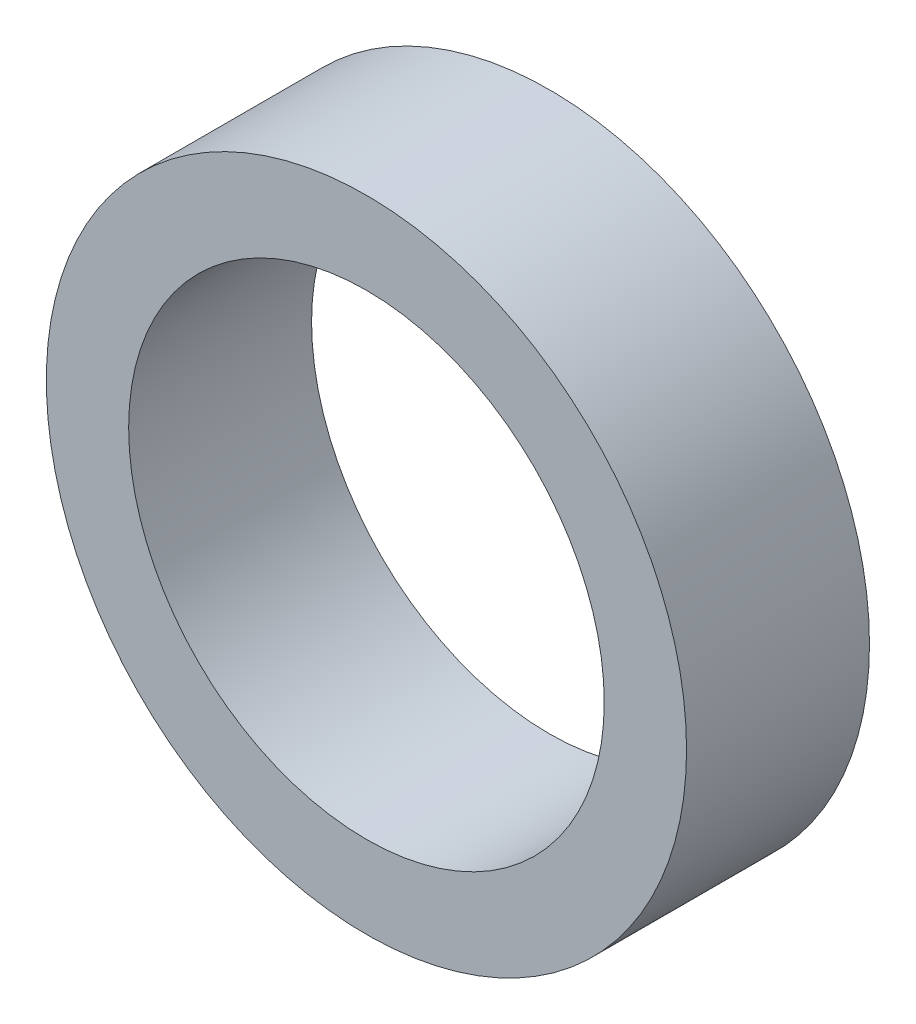
ISO-10303-21;
HEADER;
FILE_DESCRIPTION(('STEP AP214'),'2;1');
FILE_NAME('part.step','',(''),(''),'','','');
FILE_SCHEMA(('AUTOMOTIVE_DESIGN { 1 0 10303 214 1 1 1 1 }'));
ENDSEC;
DATA;
#1=APPLICATION_CONTEXT('core data for automotive mechanical design processes');
#2=APPLICATION_PROTOCOL_DEFINITION('international standard','automotive_design',2000,#1);
#3=PRODUCT_CONTEXT('',#1,'mechanical');
#4=PRODUCT('Part','Part','',(#3));
#5=PRODUCT_RELATED_PRODUCT_CATEGORY('part','',(#4));
#6=PRODUCT_DEFINITION_FORMATION('','',#4);
#7=PRODUCT_DEFINITION_CONTEXT('part definition',#1,'design');
#8=PRODUCT_DEFINITION('design','',#6,#7);
#9=PRODUCT_DEFINITION_SHAPE('','',#8);
#10=(LENGTH_UNIT() NAMED_UNIT(*) SI_UNIT(.MILLI.,.METRE.));
#11=(NAMED_UNIT(*) PLANE_ANGLE_UNIT() SI_UNIT($,.RADIAN.));
#12=(NAMED_UNIT(*) SI_UNIT($,.STERADIAN.) SOLID_ANGLE_UNIT());
#13=UNCERTAINTY_MEASURE_WITH_UNIT(LENGTH_MEASURE(1.E-05),#10,'distance_accuracy_value','');
#14=(GEOMETRIC_REPRESENTATION_CONTEXT(3) GLOBAL_UNCERTAINTY_ASSIGNED_CONTEXT((#13)) GLOBAL_UNIT_ASSIGNED_CONTEXT((#10,
#11,#12)) REPRESENTATION_CONTEXT('',''));
#15=CARTESIAN_POINT('',(0.,0.,0.));
#16=DIRECTION('',(0.,0.,1.));
#17=DIRECTION('',(1.,0.,0.));
#18=AXIS2_PLACEMENT_3D('',#15,#16,#17);
#19=CARTESIAN_POINT('',(0.,0.,1.));
#20=DIRECTION('',(0.,0.,1.));
#21=DIRECTION('',(1.,0.,0.));
#22=AXIS2_PLACEMENT_3D('',#19,#20,#21);
#23=PLANE('',#22);
#24=CARTESIAN_POINT('',(0.,0.,1.));
#25=DIRECTION('',(0.,0.,1.));
#26=DIRECTION('',(1.,0.,0.));
#27=AXIS2_PLACEMENT_3D('',#24,#25,#26);
#28=CIRCLE('',#27,3.5);
#29=CARTESIAN_POINT('',(3.5,0.,1.));
#30=VERTEX_POINT('',#29);
#31=EDGE_CURVE('E10',#30,#30,#28,.T.);
#32=ORIENTED_EDGE('',*,*,#31,.T.);
#33=EDGE_LOOP('',(#32));
#34=FACE_BOUND('',#33,.T.);
#35=CARTESIAN_POINT('',(0.,0.,1.));
#36=DIRECTION('',(0.,0.,1.));
#37=DIRECTION('',(1.,0.,0.));
#38=AXIS2_PLACEMENT_3D('',#35,#36,#37);
#39=CIRCLE('',#38,2.6);
#40=CARTESIAN_POINT('',(2.6,0.,1.));
#41=VERTEX_POINT('',#40);
#42=EDGE_CURVE('E50',#41,#41,#39,.T.);
#43=ORIENTED_EDGE('',*,*,#42,.F.);
#44=EDGE_LOOP('',(#43));
#45=FACE_BOUND('',#44,.T.);
#46=ADVANCED_FACE('F37',(#34,#45),#23,.T.);
#47=CARTESIAN_POINT('',(0.,0.,-1.));
#48=DIRECTION('',(0.,0.,1.));
#49=DIRECTION('',(1.,0.,0.));
#50=AXIS2_PLACEMENT_3D('',#47,#48,#49);
#51=PLANE('',#50);
#52=CARTESIAN_POINT('',(0.,0.,-1.));
#53=DIRECTION('',(0.,0.,1.));
#54=DIRECTION('',(1.,0.,0.));
#55=AXIS2_PLACEMENT_3D('',#52,#53,#54);
#56=CIRCLE('',#55,3.5);
#57=CARTESIAN_POINT('',(3.5,0.,-1.));
#58=VERTEX_POINT('',#57);
#59=EDGE_CURVE('E41',#58,#58,#56,.T.);
#60=ORIENTED_EDGE('',*,*,#59,.F.);
#61=EDGE_LOOP('',(#60));
#62=FACE_BOUND('',#61,.T.);
#63=CARTESIAN_POINT('',(0.,0.,-1.));
#64=DIRECTION('',(0.,0.,1.));
#65=DIRECTION('',(1.,0.,0.));
#66=AXIS2_PLACEMENT_3D('',#63,#64,#65);
#67=CIRCLE('',#66,2.6);
#68=CARTESIAN_POINT('',(2.6,0.,-1.));
#69=VERTEX_POINT('',#68);
#70=EDGE_CURVE('E52',#69,#69,#67,.T.);
#71=ORIENTED_EDGE('',*,*,#70,.T.);
#72=EDGE_LOOP('',(#71));
#73=FACE_BOUND('',#72,.T.);
#74=ADVANCED_FACE('F64',(#62,#73),#51,.F.);
#75=CARTESIAN_POINT('',(0.,0.,1.));
#76=DIRECTION('',(0.,0.,-1.));
#77=DIRECTION('',(-1.,0.,0.));
#78=AXIS2_PLACEMENT_3D('',#75,#76,#77);
#79=CYLINDRICAL_SURFACE('',#78,3.5);
#80=ORIENTED_EDGE('',*,*,#31,.F.);
#81=EDGE_LOOP('',(#80));
#82=FACE_BOUND('',#81,.T.);
#83=ORIENTED_EDGE('',*,*,#59,.T.);
#84=EDGE_LOOP('',(#83));
#85=FACE_BOUND('',#84,.T.);
#86=ADVANCED_FACE('F39',(#82,#85),#79,.T.);
#87=CARTESIAN_POINT('',(0.,0.,1.));
#88=DIRECTION('',(0.,0.,-1.));
#89=DIRECTION('',(-1.,0.,0.));
#90=AXIS2_PLACEMENT_3D('',#87,#88,#89);
#91=CYLINDRICAL_SURFACE('',#90,2.6);
#92=ORIENTED_EDGE('',*,*,#42,.T.);
#93=EDGE_LOOP('',(#92));
#94=FACE_BOUND('',#93,.T.);
#95=ORIENTED_EDGE('',*,*,#70,.F.);
#96=EDGE_LOOP('',(#95));
#97=FACE_BOUND('',#96,.T.);
#98=ADVANCED_FACE('F60',(#94,#97),#91,.F.);
#99=CLOSED_SHELL('',(#46,#74,#86,#98));
#100=MANIFOLD_SOLID_BREP('B2',#99);
#101=ADVANCED_BREP_SHAPE_REPRESENTATION('',(#18,#100),#14);
#102=SHAPE_DEFINITION_REPRESENTATION(#9,#101);
ENDSEC;
END-ISO-10303-21;
